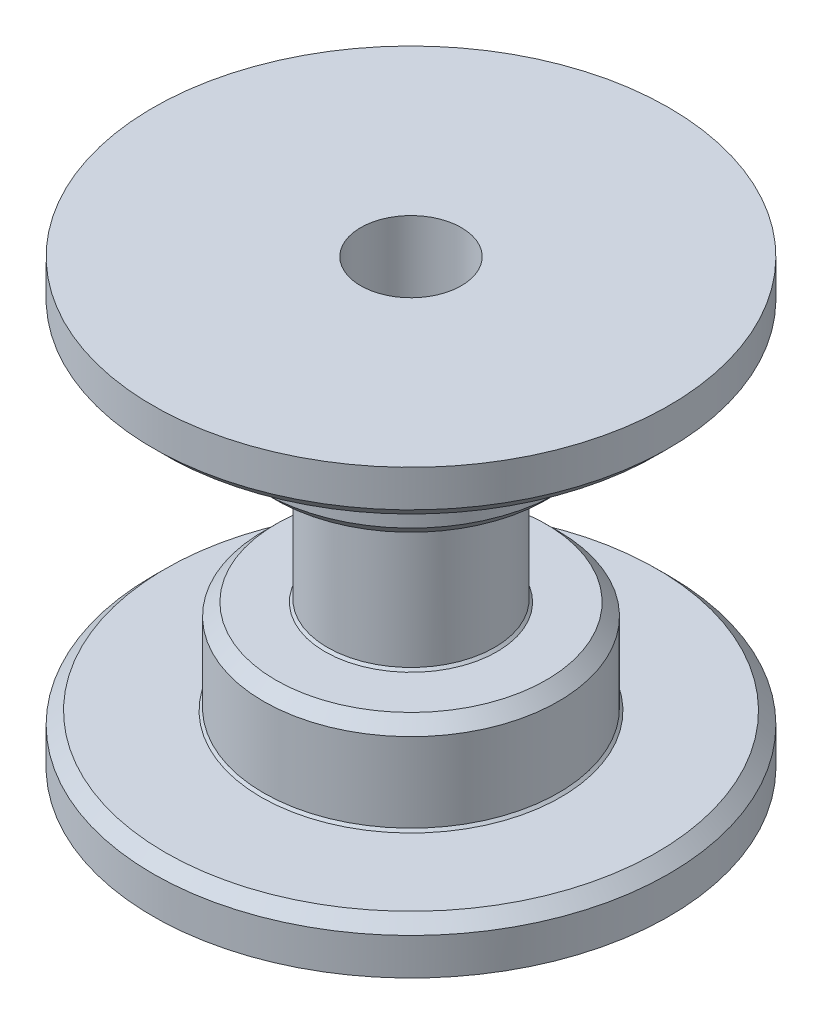
ISO-10303-21;
HEADER;
FILE_DESCRIPTION(('STEP AP214'),'2;1');
FILE_NAME('part.step','',(''),(''),'','','');
FILE_SCHEMA(('AUTOMOTIVE_DESIGN { 1 0 10303 214 1 1 1 1 }'));
ENDSEC;
DATA;
#1=APPLICATION_CONTEXT('core data for automotive mechanical design processes');
#2=APPLICATION_PROTOCOL_DEFINITION('international standard','automotive_design',2000,#1);
#3=PRODUCT_CONTEXT('',#1,'mechanical');
#4=PRODUCT('Part','Part','',(#3));
#5=PRODUCT_RELATED_PRODUCT_CATEGORY('part','',(#4));
#6=PRODUCT_DEFINITION_FORMATION('','',#4);
#7=PRODUCT_DEFINITION_CONTEXT('part definition',#1,'design');
#8=PRODUCT_DEFINITION('design','',#6,#7);
#9=PRODUCT_DEFINITION_SHAPE('','',#8);
#10=(LENGTH_UNIT() NAMED_UNIT(*) SI_UNIT(.MILLI.,.METRE.));
#11=(NAMED_UNIT(*) PLANE_ANGLE_UNIT() SI_UNIT($,.RADIAN.));
#12=(NAMED_UNIT(*) SI_UNIT($,.STERADIAN.) SOLID_ANGLE_UNIT());
#13=UNCERTAINTY_MEASURE_WITH_UNIT(LENGTH_MEASURE(1.E-05),#10,'distance_accuracy_value','');
#14=(GEOMETRIC_REPRESENTATION_CONTEXT(3) GLOBAL_UNCERTAINTY_ASSIGNED_CONTEXT((#13)) GLOBAL_UNIT_ASSIGNED_CONTEXT((#10,
#11,#12)) REPRESENTATION_CONTEXT('',''));
#15=CARTESIAN_POINT('',(0.,0.,0.));
#16=DIRECTION('',(0.,0.,1.));
#17=DIRECTION('',(1.,0.,0.));
#18=AXIS2_PLACEMENT_3D('',#15,#16,#17);
#19=CARTESIAN_POINT('',(0.,-6.35,-12.));
#20=DIRECTION('',(0.,1.,0.));
#21=DIRECTION('',(0.,0.,1.));
#22=AXIS2_PLACEMENT_3D('',#19,#20,#21);
#23=PLANE('',#22);
#24=CARTESIAN_POINT('',(0.,-6.35,0.));
#25=DIRECTION('',(0.,1.,0.));
#26=DIRECTION('',(0.,0.,1.));
#27=AXIS2_PLACEMENT_3D('',#24,#25,#26);
#28=CIRCLE('',#27,7.);
#29=CARTESIAN_POINT('',(0.,-6.35,7.));
#30=VERTEX_POINT('',#29);
#31=EDGE_CURVE('E64',#30,#30,#28,.F.);
#32=ORIENTED_EDGE('',*,*,#31,.T.);
#33=EDGE_LOOP('',(#32));
#34=FACE_BOUND('',#33,.T.);
#35=CARTESIAN_POINT('',(0.,-6.35,0.));
#36=DIRECTION('',(0.,1.,0.));
#37=DIRECTION('',(0.,0.,1.));
#38=AXIS2_PLACEMENT_3D('',#35,#36,#37);
#39=CIRCLE('',#38,11.);
#40=CARTESIAN_POINT('',(0.,-6.35,11.));
#41=VERTEX_POINT('',#40);
#42=EDGE_CURVE('E108',#41,#41,#39,.T.);
#43=ORIENTED_EDGE('',*,*,#42,.T.);
#44=EDGE_LOOP('',(#43));
#45=FACE_BOUND('',#44,.T.);
#46=ADVANCED_FACE('F47',(#34,#45),#23,.T.);
#47=CARTESIAN_POINT('',(0.,-56.1904761904762,0.));
#48=DIRECTION('',(0.,-1.,0.));
#49=DIRECTION('',(0.,0.,-1.));
#50=AXIS2_PLACEMENT_3D('',#47,#48,#49);
#51=CYLINDRICAL_SURFACE('',#50,6.8);
#52=CARTESIAN_POINT('',(0.,6.15,0.));
#53=DIRECTION('',(0.,-1.,0.));
#54=DIRECTION('',(0.,0.,-1.));
#55=AXIS2_PLACEMENT_3D('',#52,#53,#54);
#56=CIRCLE('',#55,6.8);
#57=CARTESIAN_POINT('',(0.,6.15,-6.8));
#58=VERTEX_POINT('',#57);
#59=EDGE_CURVE('E78',#58,#58,#56,.T.);
#60=ORIENTED_EDGE('',*,*,#59,.T.);
#61=EDGE_LOOP('',(#60));
#62=FACE_BOUND('',#61,.T.);
#63=CARTESIAN_POINT('',(0.,-6.15,0.));
#64=DIRECTION('',(0.,1.,0.));
#65=DIRECTION('',(0.,0.,1.));
#66=AXIS2_PLACEMENT_3D('',#63,#64,#65);
#67=CIRCLE('',#66,6.8);
#68=CARTESIAN_POINT('',(0.,-6.15,6.8));
#69=VERTEX_POINT('',#68);
#70=EDGE_CURVE('E82',#69,#69,#67,.T.);
#71=ORIENTED_EDGE('',*,*,#70,.T.);
#72=EDGE_LOOP('',(#71));
#73=FACE_BOUND('',#72,.T.);
#74=ADVANCED_FACE('F157',(#62,#73),#51,.T.);
#75=CARTESIAN_POINT('',(0.,6.35,-12.));
#76=DIRECTION('',(0.,-1.,0.));
#77=DIRECTION('',(0.,0.,-1.));
#78=AXIS2_PLACEMENT_3D('',#75,#76,#77);
#79=PLANE('',#78);
#80=CARTESIAN_POINT('',(0.,6.35,0.));
#81=DIRECTION('',(0.,-1.,0.));
#82=DIRECTION('',(0.,0.,-1.));
#83=AXIS2_PLACEMENT_3D('',#80,#81,#82);
#84=CIRCLE('',#83,7.);
#85=CARTESIAN_POINT('',(0.,6.35,-7.));
#86=VERTEX_POINT('',#85);
#87=EDGE_CURVE('E72',#86,#86,#84,.F.);
#88=ORIENTED_EDGE('',*,*,#87,.T.);
#89=EDGE_LOOP('',(#88));
#90=FACE_BOUND('',#89,.T.);
#91=CARTESIAN_POINT('',(0.,6.35,0.));
#92=DIRECTION('',(0.,-1.,0.));
#93=DIRECTION('',(0.,0.,-1.));
#94=AXIS2_PLACEMENT_3D('',#91,#92,#93);
#95=CIRCLE('',#94,11.);
#96=CARTESIAN_POINT('',(0.,6.35,-11.));
#97=VERTEX_POINT('',#96);
#98=EDGE_CURVE('E97',#97,#97,#95,.T.);
#99=ORIENTED_EDGE('',*,*,#98,.T.);
#100=EDGE_LOOP('',(#99));
#101=FACE_BOUND('',#100,.T.);
#102=ADVANCED_FACE('F163',(#90,#101),#79,.T.);
#103=CARTESIAN_POINT('',(0.,-56.1904761904762,0.));
#104=DIRECTION('',(0.,-1.,0.));
#105=DIRECTION('',(0.,0.,-1.));
#106=AXIS2_PLACEMENT_3D('',#103,#104,#105);
#107=CYLINDRICAL_SURFACE('',#106,12.);
#108=CARTESIAN_POINT('',(0.,13.8,0.));
#109=DIRECTION('',(0.,-1.,0.));
#110=DIRECTION('',(0.,0.,-1.));
#111=AXIS2_PLACEMENT_3D('',#108,#109,#110);
#112=CIRCLE('',#111,12.);
#113=CARTESIAN_POINT('',(0.,13.8,-12.));
#114=VERTEX_POINT('',#113);
#115=EDGE_CURVE('E90',#114,#114,#112,.T.);
#116=ORIENTED_EDGE('',*,*,#115,.T.);
#117=EDGE_LOOP('',(#116));
#118=FACE_BOUND('',#117,.T.);
#119=CARTESIAN_POINT('',(0.,7.34999999999998,0.));
#120=DIRECTION('',(0.,-1.,0.));
#121=DIRECTION('',(0.,0.,-1.));
#122=AXIS2_PLACEMENT_3D('',#119,#120,#121);
#123=CIRCLE('',#122,12.);
#124=CARTESIAN_POINT('',(0.,7.34999999999998,-12.));
#125=VERTEX_POINT('',#124);
#126=EDGE_CURVE('E94',#125,#125,#123,.F.);
#127=ORIENTED_EDGE('',*,*,#126,.T.);
#128=EDGE_LOOP('',(#127));
#129=FACE_BOUND('',#128,.T.);
#130=ADVANCED_FACE('F315',(#118,#129),#107,.T.);
#131=CARTESIAN_POINT('',(0.,14.,-21.));
#132=DIRECTION('',(0.,-1.,0.));
#133=DIRECTION('',(0.,0.,-1.));
#134=AXIS2_PLACEMENT_3D('',#131,#132,#133);
#135=PLANE('',#134);
#136=CARTESIAN_POINT('',(0.,14.,0.));
#137=DIRECTION('',(0.,-1.,0.));
#138=DIRECTION('',(0.,0.,-1.));
#139=AXIS2_PLACEMENT_3D('',#136,#137,#138);
#140=CIRCLE('',#139,12.2);
#141=CARTESIAN_POINT('',(0.,14.,-12.2));
#142=VERTEX_POINT('',#141);
#143=EDGE_CURVE('E86',#142,#142,#140,.F.);
#144=ORIENTED_EDGE('',*,*,#143,.T.);
#145=EDGE_LOOP('',(#144));
#146=FACE_BOUND('',#145,.T.);
#147=CARTESIAN_POINT('',(0.,14.,0.));
#148=DIRECTION('',(0.,-1.,0.));
#149=DIRECTION('',(0.,0.,-1.));
#150=AXIS2_PLACEMENT_3D('',#147,#148,#149);
#151=CIRCLE('',#150,20.);
#152=CARTESIAN_POINT('',(0.,14.,-20.));
#153=VERTEX_POINT('',#152);
#154=EDGE_CURVE('E105',#153,#153,#151,.T.);
#155=ORIENTED_EDGE('',*,*,#154,.T.);
#156=EDGE_LOOP('',(#155));
#157=FACE_BOUND('',#156,.T.);
#158=ADVANCED_FACE('F307',(#146,#157),#135,.T.);
#159=CARTESIAN_POINT('',(0.,-56.1904761904762,0.));
#160=DIRECTION('',(0.,-1.,0.));
#161=DIRECTION('',(0.,0.,-1.));
#162=AXIS2_PLACEMENT_3D('',#159,#160,#161);
#163=CYLINDRICAL_SURFACE('',#162,21.);
#164=CARTESIAN_POINT('',(0.,15.,0.));
#165=DIRECTION('',(0.,-1.,0.));
#166=DIRECTION('',(0.,0.,-1.));
#167=AXIS2_PLACEMENT_3D('',#164,#165,#166);
#168=CIRCLE('',#167,21.);
#169=CARTESIAN_POINT('',(0.,15.,-21.));
#170=VERTEX_POINT('',#169);
#171=EDGE_CURVE('E101',#170,#170,#168,.F.);
#172=ORIENTED_EDGE('',*,*,#171,.T.);
#173=EDGE_LOOP('',(#172));
#174=FACE_BOUND('',#173,.T.);
#175=CARTESIAN_POINT('',(0.,18.,0.));
#176=DIRECTION('',(0.,-1.,0.));
#177=DIRECTION('',(0.,0.,-1.));
#178=AXIS2_PLACEMENT_3D('',#175,#176,#177);
#179=CIRCLE('',#178,21.);
#180=CARTESIAN_POINT('',(0.,18.,-21.));
#181=VERTEX_POINT('',#180);
#182=EDGE_CURVE('E123',#181,#181,#179,.T.);
#183=ORIENTED_EDGE('',*,*,#182,.T.);
#184=EDGE_LOOP('',(#183));
#185=FACE_BOUND('',#184,.T.);
#186=ADVANCED_FACE('F299',(#174,#185),#163,.T.);
#187=CARTESIAN_POINT('',(0.,18.,-4.1));
#188=DIRECTION('',(0.,1.,0.));
#189=DIRECTION('',(0.,0.,1.));
#190=AXIS2_PLACEMENT_3D('',#187,#188,#189);
#191=PLANE('',#190);
#192=CARTESIAN_POINT('',(0.,18.,0.));
#193=DIRECTION('',(0.,-1.,0.));
#194=DIRECTION('',(0.,0.,-1.));
#195=AXIS2_PLACEMENT_3D('',#192,#193,#194);
#196=CIRCLE('',#195,4.1);
#197=CARTESIAN_POINT('',(0.,18.,-4.1));
#198=VERTEX_POINT('',#197);
#199=EDGE_CURVE('E127',#198,#198,#196,.T.);
#200=ORIENTED_EDGE('',*,*,#199,.T.);
#201=EDGE_LOOP('',(#200));
#202=FACE_BOUND('',#201,.T.);
#203=ORIENTED_EDGE('',*,*,#182,.F.);
#204=EDGE_LOOP('',(#203));
#205=FACE_BOUND('',#204,.T.);
#206=ADVANCED_FACE('F290',(#202,#205),#191,.T.);
#207=CARTESIAN_POINT('',(0.,-56.1904761904762,0.));
#208=DIRECTION('',(0.,-1.,0.));
#209=DIRECTION('',(0.,0.,-1.));
#210=AXIS2_PLACEMENT_3D('',#207,#208,#209);
#211=CYLINDRICAL_SURFACE('',#210,4.1);
#212=CARTESIAN_POINT('',(0.,-18.,0.));
#213=DIRECTION('',(0.,-1.,0.));
#214=DIRECTION('',(0.,0.,-1.));
#215=AXIS2_PLACEMENT_3D('',#212,#213,#214);
#216=CIRCLE('',#215,4.1);
#217=CARTESIAN_POINT('',(0.,-18.,-4.1));
#218=VERTEX_POINT('',#217);
#219=EDGE_CURVE('E130',#218,#218,#216,.T.);
#220=ORIENTED_EDGE('',*,*,#219,.T.);
#221=EDGE_LOOP('',(#220));
#222=FACE_BOUND('',#221,.T.);
#223=ORIENTED_EDGE('',*,*,#199,.F.);
#224=EDGE_LOOP('',(#223));
#225=FACE_BOUND('',#224,.T.);
#226=ADVANCED_FACE('F154',(#222,#225),#211,.F.);
#227=CARTESIAN_POINT('',(0.,-18.,-4.1));
#228=DIRECTION('',(0.,-1.,0.));
#229=DIRECTION('',(0.,0.,-1.));
#230=AXIS2_PLACEMENT_3D('',#227,#228,#229);
#231=PLANE('',#230);
#232=CARTESIAN_POINT('',(0.,-18.,0.));
#233=DIRECTION('',(0.,-1.,0.));
#234=DIRECTION('',(0.,0.,-1.));
#235=AXIS2_PLACEMENT_3D('',#232,#233,#234);
#236=CIRCLE('',#235,21.);
#237=CARTESIAN_POINT('',(0.,-18.,-21.));
#238=VERTEX_POINT('',#237);
#239=EDGE_CURVE('E134',#238,#238,#236,.T.);
#240=ORIENTED_EDGE('',*,*,#239,.T.);
#241=EDGE_LOOP('',(#240));
#242=FACE_BOUND('',#241,.T.);
#243=ORIENTED_EDGE('',*,*,#219,.F.);
#244=EDGE_LOOP('',(#243));
#245=FACE_BOUND('',#244,.T.);
#246=ADVANCED_FACE('F140',(#242,#245),#231,.T.);
#247=CARTESIAN_POINT('',(0.,-56.1904761904762,0.));
#248=DIRECTION('',(0.,-1.,0.));
#249=DIRECTION('',(0.,0.,-1.));
#250=AXIS2_PLACEMENT_3D('',#247,#248,#249);
#251=CYLINDRICAL_SURFACE('',#250,21.);
#252=CARTESIAN_POINT('',(0.,-15.,0.));
#253=DIRECTION('',(0.,1.,0.));
#254=DIRECTION('',(0.,0.,1.));
#255=AXIS2_PLACEMENT_3D('',#252,#253,#254);
#256=CIRCLE('',#255,21.);
#257=CARTESIAN_POINT('',(0.,-15.,21.));
#258=VERTEX_POINT('',#257);
#259=EDGE_CURVE('E119',#258,#258,#256,.F.);
#260=ORIENTED_EDGE('',*,*,#259,.T.);
#261=EDGE_LOOP('',(#260));
#262=FACE_BOUND('',#261,.T.);
#263=ORIENTED_EDGE('',*,*,#239,.F.);
#264=EDGE_LOOP('',(#263));
#265=FACE_BOUND('',#264,.T.);
#266=ADVANCED_FACE('F143',(#262,#265),#251,.T.);
#267=CARTESIAN_POINT('',(0.,-14.,-21.));
#268=DIRECTION('',(0.,1.,0.));
#269=DIRECTION('',(0.,0.,1.));
#270=AXIS2_PLACEMENT_3D('',#267,#268,#269);
#271=PLANE('',#270);
#272=CARTESIAN_POINT('',(0.,-14.,0.));
#273=DIRECTION('',(0.,1.,0.));
#274=DIRECTION('',(0.,0.,1.));
#275=AXIS2_PLACEMENT_3D('',#272,#273,#274);
#276=CIRCLE('',#275,12.2);
#277=CARTESIAN_POINT('',(0.,-14.,-12.2));
#278=VERTEX_POINT('',#277);
#279=EDGE_CURVE('E56',#278,#278,#276,.F.);
#280=ORIENTED_EDGE('',*,*,#279,.T.);
#281=EDGE_LOOP('',(#280));
#282=FACE_BOUND('',#281,.T.);
#283=CARTESIAN_POINT('',(0.,-14.,0.));
#284=DIRECTION('',(0.,1.,0.));
#285=DIRECTION('',(0.,0.,1.));
#286=AXIS2_PLACEMENT_3D('',#283,#284,#285);
#287=CIRCLE('',#286,20.);
#288=CARTESIAN_POINT('',(0.,-14.,20.));
#289=VERTEX_POINT('',#288);
#290=EDGE_CURVE('E116',#289,#289,#287,.T.);
#291=ORIENTED_EDGE('',*,*,#290,.T.);
#292=EDGE_LOOP('',(#291));
#293=FACE_BOUND('',#292,.T.);
#294=ADVANCED_FACE('F145',(#282,#293),#271,.T.);
#295=CARTESIAN_POINT('',(0.,-56.1904761904762,0.));
#296=DIRECTION('',(0.,-1.,0.));
#297=DIRECTION('',(0.,0.,-1.));
#298=AXIS2_PLACEMENT_3D('',#295,#296,#297);
#299=CYLINDRICAL_SURFACE('',#298,12.);
#300=CARTESIAN_POINT('',(0.,-13.8,0.));
#301=DIRECTION('',(0.,1.,0.));
#302=DIRECTION('',(0.,0.,1.));
#303=AXIS2_PLACEMENT_3D('',#300,#301,#302);
#304=CIRCLE('',#303,12.);
#305=CARTESIAN_POINT('',(0.,-13.8,-12.));
#306=VERTEX_POINT('',#305);
#307=EDGE_CURVE('E10',#306,#306,#304,.T.);
#308=ORIENTED_EDGE('',*,*,#307,.T.);
#309=EDGE_LOOP('',(#308));
#310=FACE_BOUND('',#309,.T.);
#311=CARTESIAN_POINT('',(0.,-7.35000000000002,0.));
#312=DIRECTION('',(0.,1.,0.));
#313=DIRECTION('',(0.,0.,1.));
#314=AXIS2_PLACEMENT_3D('',#311,#312,#313);
#315=CIRCLE('',#314,12.);
#316=CARTESIAN_POINT('',(0.,-7.35000000000002,12.));
#317=VERTEX_POINT('',#316);
#318=EDGE_CURVE('E112',#317,#317,#315,.F.);
#319=ORIENTED_EDGE('',*,*,#318,.T.);
#320=EDGE_LOOP('',(#319));
#321=FACE_BOUND('',#320,.T.);
#322=ADVANCED_FACE('F152',(#310,#321),#299,.T.);
#323=CARTESIAN_POINT('',(0.,-15.,0.));
#324=DIRECTION('',(0.,-1.,0.));
#325=DIRECTION('',(0.,0.,-1.));
#326=AXIS2_PLACEMENT_3D('',#323,#324,#325);
#327=CONICAL_SURFACE('',#326,21.,0.785398163397452);
#328=ORIENTED_EDGE('',*,*,#290,.F.);
#329=EDGE_LOOP('',(#328));
#330=FACE_BOUND('',#329,.T.);
#331=ORIENTED_EDGE('',*,*,#259,.F.);
#332=EDGE_LOOP('',(#331));
#333=FACE_BOUND('',#332,.T.);
#334=ADVANCED_FACE('F170',(#330,#333),#327,.T.);
#335=CARTESIAN_POINT('',(0.,-7.35000000000002,0.));
#336=DIRECTION('',(0.,-1.,0.));
#337=DIRECTION('',(0.,0.,-1.));
#338=AXIS2_PLACEMENT_3D('',#335,#336,#337);
#339=CONICAL_SURFACE('',#338,12.,0.785398163397448);
#340=ORIENTED_EDGE('',*,*,#42,.F.);
#341=EDGE_LOOP('',(#340));
#342=FACE_BOUND('',#341,.T.);
#343=ORIENTED_EDGE('',*,*,#318,.F.);
#344=EDGE_LOOP('',(#343));
#345=FACE_BOUND('',#344,.T.);
#346=ADVANCED_FACE('F176',(#342,#345),#339,.T.);
#347=CARTESIAN_POINT('',(0.,14.,0.));
#348=DIRECTION('',(0.,1.,0.));
#349=DIRECTION('',(0.,0.,1.));
#350=AXIS2_PLACEMENT_3D('',#347,#348,#349);
#351=CONICAL_SURFACE('',#350,20.,0.78539816339745);
#352=ORIENTED_EDGE('',*,*,#171,.F.);
#353=EDGE_LOOP('',(#352));
#354=FACE_BOUND('',#353,.T.);
#355=ORIENTED_EDGE('',*,*,#154,.F.);
#356=EDGE_LOOP('',(#355));
#357=FACE_BOUND('',#356,.T.);
#358=ADVANCED_FACE('F183',(#354,#357),#351,.T.);
#359=CARTESIAN_POINT('',(0.,6.34999999999999,0.));
#360=DIRECTION('',(0.,1.,0.));
#361=DIRECTION('',(0.,0.,1.));
#362=AXIS2_PLACEMENT_3D('',#359,#360,#361);
#363=CONICAL_SURFACE('',#362,11.,0.785398163397448);
#364=ORIENTED_EDGE('',*,*,#126,.F.);
#365=EDGE_LOOP('',(#364));
#366=FACE_BOUND('',#365,.T.);
#367=ORIENTED_EDGE('',*,*,#98,.F.);
#368=EDGE_LOOP('',(#367));
#369=FACE_BOUND('',#368,.T.);
#370=ADVANCED_FACE('F190',(#366,#369),#363,.T.);
#371=CARTESIAN_POINT('',(0.,13.8,0.));
#372=DIRECTION('',(0.,1.,0.));
#373=DIRECTION('',(0.,0.,1.));
#374=AXIS2_PLACEMENT_3D('',#371,#372,#373);
#375=CONICAL_SURFACE('',#374,12.,0.785398163397466);
#376=ORIENTED_EDGE('',*,*,#143,.F.);
#377=EDGE_LOOP('',(#376));
#378=FACE_BOUND('',#377,.T.);
#379=ORIENTED_EDGE('',*,*,#115,.F.);
#380=EDGE_LOOP('',(#379));
#381=FACE_BOUND('',#380,.T.);
#382=ADVANCED_FACE('F197',(#378,#381),#375,.T.);
#383=CARTESIAN_POINT('',(0.,6.15,0.));
#384=DIRECTION('',(0.,1.,0.));
#385=DIRECTION('',(0.,0.,1.));
#386=AXIS2_PLACEMENT_3D('',#383,#384,#385);
#387=CONICAL_SURFACE('',#386,6.8,0.785398163397457);
#388=ORIENTED_EDGE('',*,*,#87,.F.);
#389=EDGE_LOOP('',(#388));
#390=FACE_BOUND('',#389,.T.);
#391=ORIENTED_EDGE('',*,*,#59,.F.);
#392=EDGE_LOOP('',(#391));
#393=FACE_BOUND('',#392,.T.);
#394=ADVANCED_FACE('F204',(#390,#393),#387,.T.);
#395=CARTESIAN_POINT('',(0.,-6.35,0.));
#396=DIRECTION('',(0.,-1.,0.));
#397=DIRECTION('',(0.,0.,-1.));
#398=AXIS2_PLACEMENT_3D('',#395,#396,#397);
#399=CONICAL_SURFACE('',#398,7.00000000000001,0.78539816339744);
#400=ORIENTED_EDGE('',*,*,#70,.F.);
#401=EDGE_LOOP('',(#400));
#402=FACE_BOUND('',#401,.T.);
#403=ORIENTED_EDGE('',*,*,#31,.F.);
#404=EDGE_LOOP('',(#403));
#405=FACE_BOUND('',#404,.T.);
#406=ADVANCED_FACE('F210',(#402,#405),#399,.T.);
#407=CARTESIAN_POINT('',(0.,-14.,0.));
#408=DIRECTION('',(0.,-1.,0.));
#409=DIRECTION('',(0.,0.,-1.));
#410=AXIS2_PLACEMENT_3D('',#407,#408,#409);
#411=CONICAL_SURFACE('',#410,12.2,0.785398163397466);
#412=CARTESIAN_POINT('',(0.,-13.8,-12.));
#413=CARTESIAN_POINT('',(0.,-13.8020833333334,-12.0020833333333));
#414=CARTESIAN_POINT('',(0.,-13.8041666666667,-12.0041666666667));
#415=CARTESIAN_POINT('',(0.,-13.8083333333334,-12.0083333333333));
#416=CARTESIAN_POINT('',(0.,-13.8104166666667,-12.0104166666667));
#417=CARTESIAN_POINT('',(0.,-13.8145833333334,-12.0145833333333));
#418=CARTESIAN_POINT('',(0.,-13.8166666666667,-12.0166666666667));
#419=CARTESIAN_POINT('',(0.,-13.8208333333334,-12.0208333333333));
#420=CARTESIAN_POINT('',(0.,-13.8229166666667,-12.0229166666667));
#421=CARTESIAN_POINT('',(0.,-13.8270833333334,-12.0270833333333));
#422=CARTESIAN_POINT('',(0.,-13.8291666666667,-12.0291666666667));
#423=CARTESIAN_POINT('',(0.,-13.8333333333334,-12.0333333333333));
#424=CARTESIAN_POINT('',(0.,-13.8354166666667,-12.0354166666667));
#425=CARTESIAN_POINT('',(0.,-13.8395833333334,-12.0395833333333));
#426=CARTESIAN_POINT('',(0.,-13.8416666666667,-12.0416666666667));
#427=CARTESIAN_POINT('',(0.,-13.8458333333334,-12.0458333333333));
#428=CARTESIAN_POINT('',(0.,-13.8479166666667,-12.0479166666667));
#429=CARTESIAN_POINT('',(0.,-13.8520833333334,-12.0520833333333));
#430=CARTESIAN_POINT('',(0.,-13.8541666666667,-12.0541666666667));
#431=CARTESIAN_POINT('',(0.,-13.8583333333333,-12.0583333333333));
#432=CARTESIAN_POINT('',(0.,-13.8604166666667,-12.0604166666667));
#433=CARTESIAN_POINT('',(0.,-13.8645833333333,-12.0645833333333));
#434=CARTESIAN_POINT('',(0.,-13.8666666666667,-12.0666666666667));
#435=CARTESIAN_POINT('',(0.,-13.8708333333333,-12.0708333333333));
#436=CARTESIAN_POINT('',(0.,-13.8729166666667,-12.0729166666667));
#437=CARTESIAN_POINT('',(0.,-13.8770833333333,-12.0770833333333));
#438=CARTESIAN_POINT('',(0.,-13.8791666666667,-12.0791666666667));
#439=CARTESIAN_POINT('',(0.,-13.8833333333333,-12.0833333333333));
#440=CARTESIAN_POINT('',(0.,-13.8854166666667,-12.0854166666667));
#441=CARTESIAN_POINT('',(0.,-13.8895833333333,-12.0895833333333));
#442=CARTESIAN_POINT('',(0.,-13.8916666666667,-12.0916666666667));
#443=CARTESIAN_POINT('',(0.,-13.8958333333333,-12.0958333333333));
#444=CARTESIAN_POINT('',(0.,-13.8979166666667,-12.0979166666667));
#445=CARTESIAN_POINT('',(0.,-13.9020833333333,-12.1020833333333));
#446=CARTESIAN_POINT('',(0.,-13.9041666666667,-12.1041666666667));
#447=CARTESIAN_POINT('',(0.,-13.9083333333333,-12.1083333333333));
#448=CARTESIAN_POINT('',(0.,-13.9104166666667,-12.1104166666667));
#449=CARTESIAN_POINT('',(0.,-13.9145833333333,-12.1145833333333));
#450=CARTESIAN_POINT('',(0.,-13.9166666666667,-12.1166666666667));
#451=CARTESIAN_POINT('',(0.,-13.9208333333333,-12.1208333333333));
#452=CARTESIAN_POINT('',(0.,-13.9229166666667,-12.1229166666667));
#453=CARTESIAN_POINT('',(0.,-13.9270833333333,-12.1270833333333));
#454=CARTESIAN_POINT('',(0.,-13.9291666666667,-12.1291666666667));
#455=CARTESIAN_POINT('',(0.,-13.9333333333333,-12.1333333333333));
#456=CARTESIAN_POINT('',(0.,-13.9354166666667,-12.1354166666667));
#457=CARTESIAN_POINT('',(0.,-13.9395833333333,-12.1395833333333));
#458=CARTESIAN_POINT('',(0.,-13.9416666666667,-12.1416666666667));
#459=CARTESIAN_POINT('',(0.,-13.9458333333333,-12.1458333333333));
#460=CARTESIAN_POINT('',(0.,-13.9479166666667,-12.1479166666667));
#461=CARTESIAN_POINT('',(0.,-13.9520833333333,-12.1520833333333));
#462=CARTESIAN_POINT('',(0.,-13.9541666666667,-12.1541666666667));
#463=CARTESIAN_POINT('',(0.,-13.9583333333333,-12.1583333333333));
#464=CARTESIAN_POINT('',(0.,-13.9604166666667,-12.1604166666667));
#465=CARTESIAN_POINT('',(0.,-13.9645833333333,-12.1645833333333));
#466=CARTESIAN_POINT('',(0.,-13.9666666666667,-12.1666666666667));
#467=CARTESIAN_POINT('',(0.,-13.9708333333333,-12.1708333333333));
#468=CARTESIAN_POINT('',(0.,-13.9729166666667,-12.1729166666667));
#469=CARTESIAN_POINT('',(0.,-13.9770833333333,-12.1770833333333));
#470=CARTESIAN_POINT('',(0.,-13.9791666666667,-12.1791666666667));
#471=CARTESIAN_POINT('',(0.,-13.9833333333333,-12.1833333333333));
#472=CARTESIAN_POINT('',(0.,-13.9854166666667,-12.1854166666667));
#473=CARTESIAN_POINT('',(0.,-13.9895833333333,-12.1895833333333));
#474=CARTESIAN_POINT('',(0.,-13.9916666666667,-12.1916666666667));
#475=CARTESIAN_POINT('',(0.,-13.9958333333333,-12.1958333333333));
#476=CARTESIAN_POINT('',(0.,-13.9979166666667,-12.1979166666667));
#477=CARTESIAN_POINT('',(0.,-14.,-12.2));
#478=B_SPLINE_CURVE_WITH_KNOTS('',3,(#412,#413,#414,#415,#416,#417,#418,#419,#420,#421,#422,
#423,#424,#425,#426,#427,#428,#429,#430,#431,#432,#433,#434,#435,#436,#437,#438,#439,#440,#441,
#442,#443,#444,#445,#446,#447,#448,#449,#450,#451,#452,#453,#454,#455,#456,#457,#458,#459,#460,
#461,#462,#463,#464,#465,#466,#467,#468,#469,#470,#471,#472,#473,#474,#475,#476,#477),
.UNSPECIFIED.,.F.,.F.,(4,2,2,2,2,2,2,2,2,2,2,2,2,2,2,2,2,2,2,2,2,2,2,2,2,2,2,2,2,2,2,2,4),(0.,
0.0088388347648321,0.017677669529663,0.0265165042944938,0.0353553390593247,0.0441941738241556,
0.0530330085889864,0.0618718433538185,0.0707106781186494,0.0795495128834803,0.0883883476483111,
0.097227182413142,0.106066017177973,0.114904851942805,0.123743686707636,0.132582521472467,
0.141421356237298,0.150260191002128,0.159099025766959,0.16793786053179,0.176776695296622,
0.185615530061453,0.194454364826284,0.203293199591115,0.212132034355946,0.220970869120777,
0.229809703885609,0.23864853865044,0.247487373415271,0.256326208180101,0.265165042944932,
0.274003877709763,0.282842712474595),.UNSPECIFIED.);
#479=EDGE_CURVE('BSEAM50',#306,#278,#478,.T.);
#480=ORIENTED_EDGE('',*,*,#307,.F.);
#481=ORIENTED_EDGE('',*,*,#279,.F.);
#482=ORIENTED_EDGE('',*,*,#479,.T.);
#483=ORIENTED_EDGE('',*,*,#479,.F.);
#484=EDGE_LOOP('',(#480,#482,#481,#483));
#485=FACE_BOUND('',#484,.T.);
#486=ADVANCED_FACE('F50',(#485),#411,.T.);
#487=CLOSED_SHELL('',(#46,#74,#102,#130,#158,#186,#206,#226,#246,#266,#294,#322,#334,#346,#358,
#370,#382,#394,#406,#486));
#488=MANIFOLD_SOLID_BREP('B2',#487);
#489=ADVANCED_BREP_SHAPE_REPRESENTATION('',(#18,#488),#14);
#490=SHAPE_DEFINITION_REPRESENTATION(#9,#489);
ENDSEC;
END-ISO-10303-21;
